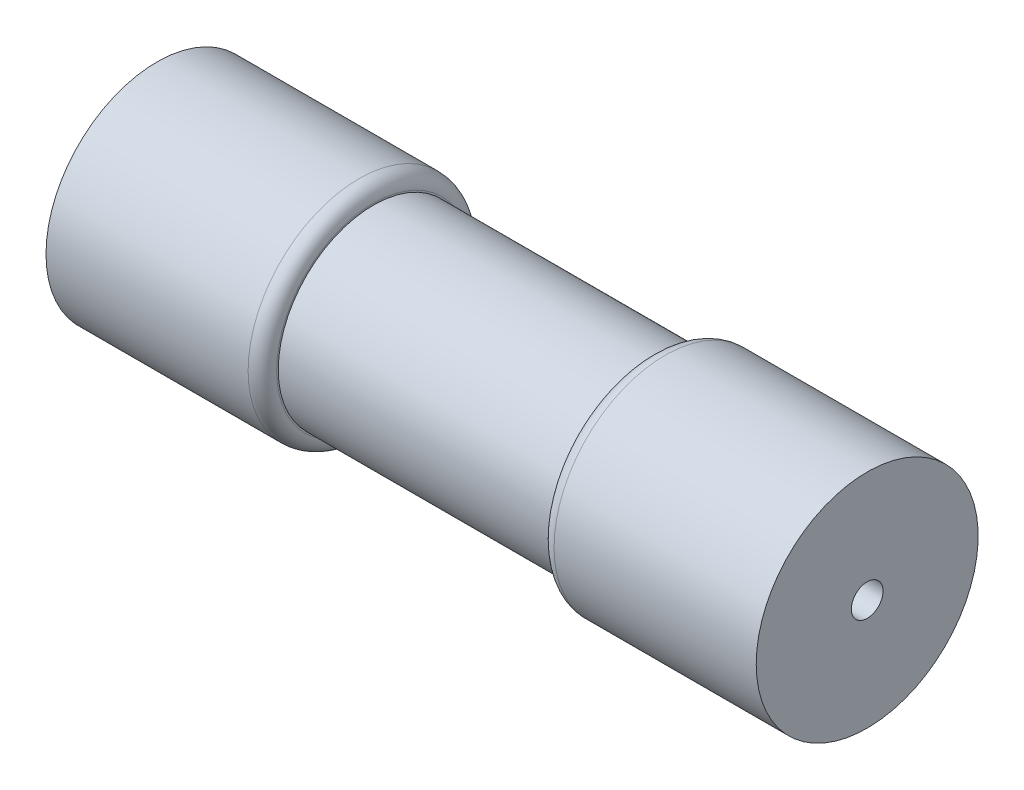
ISO-10303-21;
HEADER;
FILE_DESCRIPTION(('STEP AP214'),'2;1');
FILE_NAME('part.step','',(''),(''),'','','');
FILE_SCHEMA(('AUTOMOTIVE_DESIGN { 1 0 10303 214 1 1 1 1 }'));
ENDSEC;
DATA;
#1=APPLICATION_CONTEXT('core data for automotive mechanical design processes');
#2=APPLICATION_PROTOCOL_DEFINITION('international standard','automotive_design',2000,#1);
#3=PRODUCT_CONTEXT('',#1,'mechanical');
#4=PRODUCT('Part','Part','',(#3));
#5=PRODUCT_RELATED_PRODUCT_CATEGORY('part','',(#4));
#6=PRODUCT_DEFINITION_FORMATION('','',#4);
#7=PRODUCT_DEFINITION_CONTEXT('part definition',#1,'design');
#8=PRODUCT_DEFINITION('design','',#6,#7);
#9=PRODUCT_DEFINITION_SHAPE('','',#8);
#10=(LENGTH_UNIT() NAMED_UNIT(*) SI_UNIT(.MILLI.,.METRE.));
#11=(NAMED_UNIT(*) PLANE_ANGLE_UNIT() SI_UNIT($,.RADIAN.));
#12=(NAMED_UNIT(*) SI_UNIT($,.STERADIAN.) SOLID_ANGLE_UNIT());
#13=UNCERTAINTY_MEASURE_WITH_UNIT(LENGTH_MEASURE(1.E-05),#10,'distance_accuracy_value','');
#14=(GEOMETRIC_REPRESENTATION_CONTEXT(3) GLOBAL_UNCERTAINTY_ASSIGNED_CONTEXT((#13)) GLOBAL_UNIT_ASSIGNED_CONTEXT((#10,
#11,#12)) REPRESENTATION_CONTEXT('',''));
#15=CARTESIAN_POINT('',(0.,0.,0.));
#16=DIRECTION('',(0.,0.,1.));
#17=DIRECTION('',(1.,0.,0.));
#18=AXIS2_PLACEMENT_3D('',#15,#16,#17);
#19=CARTESIAN_POINT('',(320.5,0.,0.));
#20=DIRECTION('',(-1.,0.,0.));
#21=DIRECTION('',(0.,0.,1.));
#22=AXIS2_PLACEMENT_3D('',#19,#20,#21);
#23=TOROIDAL_SURFACE('',#22,61.,9.00000000000001);
#24=CARTESIAN_POINT('',(320.5,0.,0.));
#25=DIRECTION('',(-1.,0.,0.));
#26=DIRECTION('',(0.,0.,1.));
#27=AXIS2_PLACEMENT_3D('',#24,#25,#26);
#28=CIRCLE('',#27,70.);
#29=CARTESIAN_POINT('',(320.5,0.,70.));
#30=VERTEX_POINT('',#29);
#31=EDGE_CURVE('E71',#30,#30,#28,.T.);
#32=ORIENTED_EDGE('',*,*,#31,.T.);
#33=EDGE_LOOP('',(#32));
#34=FACE_BOUND('',#33,.T.);
#35=CARTESIAN_POINT('',(311.5,0.,0.));
#36=DIRECTION('',(-1.,0.,0.));
#37=DIRECTION('',(0.,0.,1.));
#38=AXIS2_PLACEMENT_3D('',#35,#36,#37);
#39=CIRCLE('',#38,61.);
#40=CARTESIAN_POINT('',(311.5,0.,61.));
#41=VERTEX_POINT('',#40);
#42=EDGE_CURVE('E10',#41,#41,#39,.T.);
#43=ORIENTED_EDGE('',*,*,#42,.F.);
#44=EDGE_LOOP('',(#43));
#45=FACE_BOUND('',#44,.T.);
#46=ADVANCED_FACE('F37',(#34,#45),#23,.T.);
#47=CARTESIAN_POINT('',(311.5,0.,0.));
#48=DIRECTION('',(-1.,0.,0.));
#49=DIRECTION('',(0.,0.,1.));
#50=AXIS2_PLACEMENT_3D('',#47,#48,#49);
#51=PLANE('',#50);
#52=ORIENTED_EDGE('',*,*,#42,.T.);
#53=EDGE_LOOP('',(#52));
#54=FACE_BOUND('',#53,.T.);
#55=CARTESIAN_POINT('',(311.5,0.,0.));
#56=DIRECTION('',(-1.,0.,0.));
#57=DIRECTION('',(0.,0.,1.));
#58=AXIS2_PLACEMENT_3D('',#55,#56,#57);
#59=CIRCLE('',#58,60.);
#60=CARTESIAN_POINT('',(311.5,0.,60.));
#61=VERTEX_POINT('',#60);
#62=EDGE_CURVE('E43',#61,#61,#59,.T.);
#63=ORIENTED_EDGE('',*,*,#62,.F.);
#64=EDGE_LOOP('',(#63));
#65=FACE_BOUND('',#64,.T.);
#66=ADVANCED_FACE('F89',(#54,#65),#51,.T.);
#67=CARTESIAN_POINT('',(0.,0.,0.));
#68=DIRECTION('',(-1.,0.,0.));
#69=DIRECTION('',(0.,0.,1.));
#70=AXIS2_PLACEMENT_3D('',#67,#68,#69);
#71=CYLINDRICAL_SURFACE('',#70,60.);
#72=ORIENTED_EDGE('',*,*,#62,.T.);
#73=EDGE_LOOP('',(#72));
#74=FACE_BOUND('',#73,.T.);
#75=CARTESIAN_POINT('',(136.5,0.,0.));
#76=DIRECTION('',(-1.,0.,0.));
#77=DIRECTION('',(0.,0.,1.));
#78=AXIS2_PLACEMENT_3D('',#75,#76,#77);
#79=CIRCLE('',#78,60.);
#80=CARTESIAN_POINT('',(136.5,0.,60.));
#81=VERTEX_POINT('',#80);
#82=EDGE_CURVE('E47',#81,#81,#79,.T.);
#83=ORIENTED_EDGE('',*,*,#82,.F.);
#84=EDGE_LOOP('',(#83));
#85=FACE_BOUND('',#84,.T.);
#86=ADVANCED_FACE('F93',(#74,#85),#71,.T.);
#87=CARTESIAN_POINT('',(136.5,0.,0.));
#88=DIRECTION('',(1.,0.,0.));
#89=DIRECTION('',(0.,0.,-1.));
#90=AXIS2_PLACEMENT_3D('',#87,#88,#89);
#91=PLANE('',#90);
#92=ORIENTED_EDGE('',*,*,#82,.T.);
#93=EDGE_LOOP('',(#92));
#94=FACE_BOUND('',#93,.T.);
#95=CARTESIAN_POINT('',(136.5,0.,0.));
#96=DIRECTION('',(-1.,0.,0.));
#97=DIRECTION('',(0.,0.,1.));
#98=AXIS2_PLACEMENT_3D('',#95,#96,#97);
#99=CIRCLE('',#98,61.);
#100=CARTESIAN_POINT('',(136.5,0.,61.));
#101=VERTEX_POINT('',#100);
#102=EDGE_CURVE('E51',#101,#101,#99,.T.);
#103=ORIENTED_EDGE('',*,*,#102,.F.);
#104=EDGE_LOOP('',(#103));
#105=FACE_BOUND('',#104,.T.);
#106=ADVANCED_FACE('F97',(#94,#105),#91,.T.);
#107=CARTESIAN_POINT('',(127.5,0.,0.));
#108=DIRECTION('',(-1.,0.,0.));
#109=DIRECTION('',(0.,0.,1.));
#110=AXIS2_PLACEMENT_3D('',#107,#108,#109);
#111=TOROIDAL_SURFACE('',#110,61.,9.00000000000001);
#112=ORIENTED_EDGE('',*,*,#102,.T.);
#113=EDGE_LOOP('',(#112));
#114=FACE_BOUND('',#113,.T.);
#115=CARTESIAN_POINT('',(127.5,0.,0.));
#116=DIRECTION('',(-1.,0.,0.));
#117=DIRECTION('',(0.,0.,1.));
#118=AXIS2_PLACEMENT_3D('',#115,#116,#117);
#119=CIRCLE('',#118,70.);
#120=CARTESIAN_POINT('',(127.5,0.,70.));
#121=VERTEX_POINT('',#120);
#122=EDGE_CURVE('E56',#121,#121,#119,.T.);
#123=ORIENTED_EDGE('',*,*,#122,.F.);
#124=EDGE_LOOP('',(#123));
#125=FACE_BOUND('',#124,.T.);
#126=ADVANCED_FACE('F103',(#114,#125),#111,.T.);
#127=CARTESIAN_POINT('',(0.,0.,0.));
#128=DIRECTION('',(-1.,0.,0.));
#129=DIRECTION('',(0.,0.,1.));
#130=AXIS2_PLACEMENT_3D('',#127,#128,#129);
#131=CYLINDRICAL_SURFACE('',#130,70.);
#132=ORIENTED_EDGE('',*,*,#122,.T.);
#133=EDGE_LOOP('',(#132));
#134=FACE_BOUND('',#133,.T.);
#135=CARTESIAN_POINT('',(0.,0.,0.));
#136=DIRECTION('',(-1.,0.,0.));
#137=DIRECTION('',(0.,0.,1.));
#138=AXIS2_PLACEMENT_3D('',#135,#136,#137);
#139=CIRCLE('',#138,70.);
#140=CARTESIAN_POINT('',(0.,0.,70.));
#141=VERTEX_POINT('',#140);
#142=EDGE_CURVE('E59',#141,#141,#139,.T.);
#143=ORIENTED_EDGE('',*,*,#142,.F.);
#144=EDGE_LOOP('',(#143));
#145=FACE_BOUND('',#144,.T.);
#146=ADVANCED_FACE('F107',(#134,#145),#131,.T.);
#147=CARTESIAN_POINT('',(0.,0.,0.));
#148=DIRECTION('',(-1.,0.,0.));
#149=DIRECTION('',(0.,0.,1.));
#150=AXIS2_PLACEMENT_3D('',#147,#148,#149);
#151=PLANE('',#150);
#152=ORIENTED_EDGE('',*,*,#142,.T.);
#153=EDGE_LOOP('',(#152));
#154=FACE_BOUND('',#153,.T.);
#155=CARTESIAN_POINT('',(0.,0.,0.));
#156=DIRECTION('',(-1.,0.,0.));
#157=DIRECTION('',(0.,0.,1.));
#158=AXIS2_PLACEMENT_3D('',#155,#156,#157);
#159=CIRCLE('',#158,10.);
#160=CARTESIAN_POINT('',(0.,0.,10.));
#161=VERTEX_POINT('',#160);
#162=EDGE_CURVE('E62',#161,#161,#159,.T.);
#163=ORIENTED_EDGE('',*,*,#162,.F.);
#164=EDGE_LOOP('',(#163));
#165=FACE_BOUND('',#164,.T.);
#166=ADVANCED_FACE('F111',(#154,#165),#151,.T.);
#167=CARTESIAN_POINT('',(0.,0.,0.));
#168=DIRECTION('',(-1.,0.,0.));
#169=DIRECTION('',(0.,0.,1.));
#170=AXIS2_PLACEMENT_3D('',#167,#168,#169);
#171=CYLINDRICAL_SURFACE('',#170,10.);
#172=CARTESIAN_POINT('',(448.,0.,0.));
#173=DIRECTION('',(-1.,0.,0.));
#174=DIRECTION('',(0.,0.,1.));
#175=AXIS2_PLACEMENT_3D('',#172,#173,#174);
#176=CIRCLE('',#175,10.);
#177=CARTESIAN_POINT('',(448.,0.,10.));
#178=VERTEX_POINT('',#177);
#179=EDGE_CURVE('E65',#178,#178,#176,.T.);
#180=ORIENTED_EDGE('',*,*,#179,.F.);
#181=EDGE_LOOP('',(#180));
#182=FACE_BOUND('',#181,.T.);
#183=ORIENTED_EDGE('',*,*,#162,.T.);
#184=EDGE_LOOP('',(#183));
#185=FACE_BOUND('',#184,.T.);
#186=ADVANCED_FACE('F85',(#182,#185),#171,.F.);
#187=CARTESIAN_POINT('',(448.,0.,0.));
#188=DIRECTION('',(1.,0.,0.));
#189=DIRECTION('',(0.,0.,-1.));
#190=AXIS2_PLACEMENT_3D('',#187,#188,#189);
#191=PLANE('',#190);
#192=ORIENTED_EDGE('',*,*,#179,.T.);
#193=EDGE_LOOP('',(#192));
#194=FACE_BOUND('',#193,.T.);
#195=CARTESIAN_POINT('',(448.,0.,0.));
#196=DIRECTION('',(-1.,0.,0.));
#197=DIRECTION('',(0.,0.,1.));
#198=AXIS2_PLACEMENT_3D('',#195,#196,#197);
#199=CIRCLE('',#198,70.);
#200=CARTESIAN_POINT('',(448.,0.,70.));
#201=VERTEX_POINT('',#200);
#202=EDGE_CURVE('E68',#201,#201,#199,.T.);
#203=ORIENTED_EDGE('',*,*,#202,.F.);
#204=EDGE_LOOP('',(#203));
#205=FACE_BOUND('',#204,.T.);
#206=ADVANCED_FACE('F79',(#194,#205),#191,.T.);
#207=CARTESIAN_POINT('',(0.,0.,0.));
#208=DIRECTION('',(-1.,0.,0.));
#209=DIRECTION('',(0.,0.,1.));
#210=AXIS2_PLACEMENT_3D('',#207,#208,#209);
#211=CYLINDRICAL_SURFACE('',#210,70.);
#212=ORIENTED_EDGE('',*,*,#202,.T.);
#213=EDGE_LOOP('',(#212));
#214=FACE_BOUND('',#213,.T.);
#215=ORIENTED_EDGE('',*,*,#31,.F.);
#216=EDGE_LOOP('',(#215));
#217=FACE_BOUND('',#216,.T.);
#218=ADVANCED_FACE('F77',(#214,#217),#211,.T.);
#219=CLOSED_SHELL('',(#46,#66,#86,#106,#126,#146,#166,#186,#206,#218));
#220=MANIFOLD_SOLID_BREP('B2',#219);
#221=ADVANCED_BREP_SHAPE_REPRESENTATION('',(#18,#220),#14);
#222=SHAPE_DEFINITION_REPRESENTATION(#9,#221);
ENDSEC;
END-ISO-10303-21;
